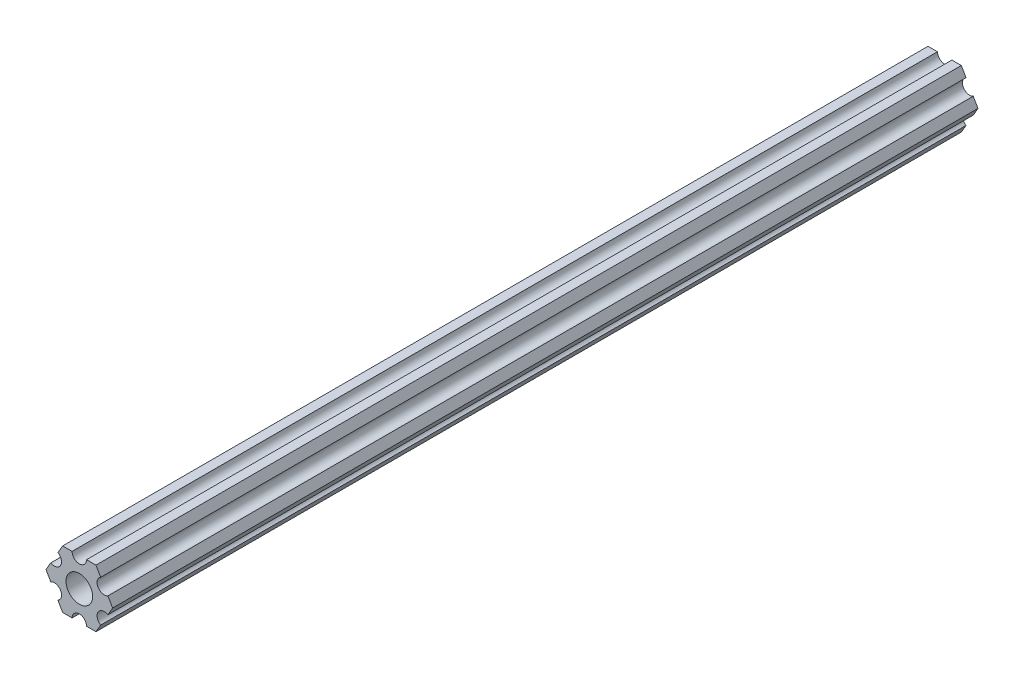
ISO-10303-21;
HEADER;
FILE_DESCRIPTION(('STEP AP214'),'2;1');
FILE_NAME('part.step','',(''),(''),'','','');
FILE_SCHEMA(('AUTOMOTIVE_DESIGN { 1 0 10303 214 1 1 1 1 }'));
ENDSEC;
DATA;
#1=APPLICATION_CONTEXT('core data for automotive mechanical design processes');
#2=APPLICATION_PROTOCOL_DEFINITION('international standard','automotive_design',2000,#1);
#3=PRODUCT_CONTEXT('',#1,'mechanical');
#4=PRODUCT('Part','Part','',(#3));
#5=PRODUCT_RELATED_PRODUCT_CATEGORY('part','',(#4));
#6=PRODUCT_DEFINITION_FORMATION('','',#4);
#7=PRODUCT_DEFINITION_CONTEXT('part definition',#1,'design');
#8=PRODUCT_DEFINITION('design','',#6,#7);
#9=PRODUCT_DEFINITION_SHAPE('','',#8);
#10=(LENGTH_UNIT() NAMED_UNIT(*) SI_UNIT(.MILLI.,.METRE.));
#11=(NAMED_UNIT(*) PLANE_ANGLE_UNIT() SI_UNIT($,.RADIAN.));
#12=(NAMED_UNIT(*) SI_UNIT($,.STERADIAN.) SOLID_ANGLE_UNIT());
#13=UNCERTAINTY_MEASURE_WITH_UNIT(LENGTH_MEASURE(1.E-05),#10,'distance_accuracy_value','');
#14=(GEOMETRIC_REPRESENTATION_CONTEXT(3) GLOBAL_UNCERTAINTY_ASSIGNED_CONTEXT((#13)) GLOBAL_UNIT_ASSIGNED_CONTEXT((#10,
#11,#12)) REPRESENTATION_CONTEXT('',''));
#15=CARTESIAN_POINT('',(0.,0.,0.));
#16=DIRECTION('',(0.,0.,1.));
#17=DIRECTION('',(1.,0.,0.));
#18=AXIS2_PLACEMENT_3D('',#15,#16,#17);
#19=CARTESIAN_POINT('',(5.49926169873049,-3.17500022210629,114.3));
#20=DIRECTION('',(0.,0.,1.));
#21=DIRECTION('',(1.,0.,0.));
#22=AXIS2_PLACEMENT_3D('',#19,#20,#21);
#23=CYLINDRICAL_SURFACE('',#22,1.5875);
#24=CARTESIAN_POINT('',(5.49926169873049,-3.17500022210629,304.8));
#25=DIRECTION('',(0.,0.,-1.));
#26=DIRECTION('',(-1.,0.,0.));
#27=AXIS2_PLACEMENT_3D('',#24,#25,#26);
#28=CIRCLE('',#27,1.5875);
#29=CARTESIAN_POINT('',(4.7055116987305,-4.5498155506141,304.8));
#30=VERTEX_POINT('',#29);
#31=CARTESIAN_POINT('',(6.29301169873047,-1.80018489359848,304.8));
#32=VERTEX_POINT('',#31);
#33=EDGE_CURVE('E189',#30,#32,#28,.T.);
#34=ORIENTED_EDGE('',*,*,#33,.F.);
#35=DIRECTION('',(0.,0.,1.));
#36=VECTOR('',#35,1.);
#37=CARTESIAN_POINT('',(4.7055116987305,-4.5498155506141,114.3));
#38=LINE('',#37,#36);
#39=CARTESIAN_POINT('',(4.7055116987305,-4.5498155506141,114.3));
#40=VERTEX_POINT('',#39);
#41=EDGE_CURVE('E11',#40,#30,#38,.T.);
#42=ORIENTED_EDGE('',*,*,#41,.F.);
#43=CARTESIAN_POINT('',(5.49926169873049,-3.17500022210629,114.3));
#44=DIRECTION('',(0.,0.,-1.));
#45=DIRECTION('',(-1.,0.,0.));
#46=AXIS2_PLACEMENT_3D('',#43,#44,#45);
#47=CIRCLE('',#46,1.5875);
#48=CARTESIAN_POINT('',(6.29301169873047,-1.80018489359848,114.3));
#49=VERTEX_POINT('',#48);
#50=EDGE_CURVE('E240',#40,#49,#47,.T.);
#51=ORIENTED_EDGE('',*,*,#50,.T.);
#52=DIRECTION('',(0.,0.,1.));
#53=VECTOR('',#52,1.);
#54=CARTESIAN_POINT('',(6.29301169873047,-1.80018489359848,114.3));
#55=LINE('',#54,#53);
#56=EDGE_CURVE('E35',#49,#32,#55,.T.);
#57=ORIENTED_EDGE('',*,*,#56,.T.);
#58=EDGE_LOOP('',(#34,#42,#51,#57));
#59=FACE_BOUND('',#58,.T.);
#60=ADVANCED_FACE('F32',(#59),#23,.F.);
#61=CARTESIAN_POINT('',(3.6661745940535,-6.35000022210627,114.3));
#62=DIRECTION('',(0.866025403784446,-0.499999999999988,0.));
#63=DIRECTION('',(0.499999999999988,0.866025403784446,0.));
#64=AXIS2_PLACEMENT_3D('',#61,#62,#63);
#65=PLANE('',#64);
#66=DIRECTION('',(0.499999999999988,0.866025403784446,0.));
#67=VECTOR('',#66,1.);
#68=CARTESIAN_POINT('',(3.6661745940535,-6.35000022210627,304.8));
#69=LINE('',#68,#67);
#70=CARTESIAN_POINT('',(3.6661745940535,-6.35000022210627,304.8));
#71=VERTEX_POINT('',#70);
#72=EDGE_CURVE('E238',#71,#30,#69,.T.);
#73=ORIENTED_EDGE('',*,*,#72,.F.);
#74=DIRECTION('',(0.,0.,1.));
#75=VECTOR('',#74,1.);
#76=CARTESIAN_POINT('',(3.6661745940535,-6.35000022210627,114.3));
#77=LINE('',#76,#75);
#78=CARTESIAN_POINT('',(3.6661745940535,-6.35000022210627,114.3));
#79=VERTEX_POINT('',#78);
#80=EDGE_CURVE('E41',#79,#71,#77,.T.);
#81=ORIENTED_EDGE('',*,*,#80,.F.);
#82=DIRECTION('',(0.499999999999988,0.866025403784446,0.));
#83=VECTOR('',#82,1.);
#84=CARTESIAN_POINT('',(3.6661745940535,-6.35000022210627,114.3));
#85=LINE('',#84,#83);
#86=EDGE_CURVE('E179',#79,#40,#85,.T.);
#87=ORIENTED_EDGE('',*,*,#86,.T.);
#88=ORIENTED_EDGE('',*,*,#41,.T.);
#89=EDGE_LOOP('',(#73,#81,#87,#88));
#90=FACE_BOUND('',#89,.T.);
#91=ADVANCED_FACE('F272',(#90),#65,.T.);
#92=CARTESIAN_POINT('',(1.58750038469929,-6.35000022210627,114.3));
#93=DIRECTION('',(0.,-1.,0.));
#94=DIRECTION('',(0.,0.,-1.));
#95=AXIS2_PLACEMENT_3D('',#92,#93,#94);
#96=PLANE('',#95);
#97=DIRECTION('',(1.,0.,0.));
#98=VECTOR('',#97,1.);
#99=CARTESIAN_POINT('',(1.58750038469929,-6.35000022210627,304.8));
#100=LINE('',#99,#98);
#101=CARTESIAN_POINT('',(1.58750038469929,-6.35000022210627,304.8));
#102=VERTEX_POINT('',#101);
#103=EDGE_CURVE('E166',#102,#71,#100,.T.);
#104=ORIENTED_EDGE('',*,*,#103,.F.);
#105=DIRECTION('',(0.,0.,1.));
#106=VECTOR('',#105,1.);
#107=CARTESIAN_POINT('',(1.58750038469929,-6.35000022210627,114.3));
#108=LINE('',#107,#106);
#109=CARTESIAN_POINT('',(1.58750038469929,-6.35000022210627,114.3));
#110=VERTEX_POINT('',#109);
#111=EDGE_CURVE('E161',#110,#102,#108,.T.);
#112=ORIENTED_EDGE('',*,*,#111,.F.);
#113=DIRECTION('',(1.,0.,0.));
#114=VECTOR('',#113,1.);
#115=CARTESIAN_POINT('',(1.58750038469929,-6.35000022210627,114.3));
#116=LINE('',#115,#114);
#117=EDGE_CURVE('E164',#110,#79,#116,.T.);
#118=ORIENTED_EDGE('',*,*,#117,.T.);
#119=ORIENTED_EDGE('',*,*,#80,.T.);
#120=EDGE_LOOP('',(#104,#112,#118,#119));
#121=FACE_BOUND('',#120,.T.);
#122=ADVANCED_FACE('F163',(#121),#96,.T.);
#123=CARTESIAN_POINT('',(3.84699290671026E-07,-6.35000022210627,114.3));
#124=DIRECTION('',(0.,0.,1.));
#125=DIRECTION('',(1.,0.,0.));
#126=AXIS2_PLACEMENT_3D('',#123,#124,#125);
#127=CYLINDRICAL_SURFACE('',#126,1.5875);
#128=CARTESIAN_POINT('',(3.84699290671026E-07,-6.35000022210627,304.8));
#129=DIRECTION('',(0.,0.,-1.));
#130=DIRECTION('',(-1.,0.,0.));
#131=AXIS2_PLACEMENT_3D('',#128,#129,#130);
#132=CIRCLE('',#131,1.5875);
#133=CARTESIAN_POINT('',(-1.58749961530071,-6.35000022210627,304.8));
#134=VERTEX_POINT('',#133);
#135=EDGE_CURVE('E235',#134,#102,#132,.T.);
#136=ORIENTED_EDGE('',*,*,#135,.F.);
#137=DIRECTION('',(0.,0.,1.));
#138=VECTOR('',#137,1.);
#139=CARTESIAN_POINT('',(-1.58749961530071,-6.35000022210627,114.3));
#140=LINE('',#139,#138);
#141=CARTESIAN_POINT('',(-1.58749961530071,-6.35000022210627,114.3));
#142=VERTEX_POINT('',#141);
#143=EDGE_CURVE('E171',#142,#134,#140,.T.);
#144=ORIENTED_EDGE('',*,*,#143,.F.);
#145=CARTESIAN_POINT('',(3.84699290671026E-07,-6.35000022210627,114.3));
#146=DIRECTION('',(0.,0.,-1.));
#147=DIRECTION('',(-1.,0.,0.));
#148=AXIS2_PLACEMENT_3D('',#145,#146,#147);
#149=CIRCLE('',#148,1.5875);
#150=EDGE_CURVE('E177',#142,#110,#149,.T.);
#151=ORIENTED_EDGE('',*,*,#150,.T.);
#152=ORIENTED_EDGE('',*,*,#111,.T.);
#153=EDGE_LOOP('',(#136,#144,#151,#152));
#154=FACE_BOUND('',#153,.T.);
#155=ADVANCED_FACE('F181',(#154),#127,.F.);
#156=CARTESIAN_POINT('',(-3.66617382465478,-6.35000022210627,114.3));
#157=DIRECTION('',(0.,-1.,0.));
#158=DIRECTION('',(1.,0.,0.));
#159=AXIS2_PLACEMENT_3D('',#156,#157,#158);
#160=PLANE('',#159);
#161=DIRECTION('',(1.,0.,0.));
#162=VECTOR('',#161,1.);
#163=CARTESIAN_POINT('',(-3.66617382465478,-6.35000022210627,304.8));
#164=LINE('',#163,#162);
#165=CARTESIAN_POINT('',(-3.66617382465478,-6.35000022210627,304.8));
#166=VERTEX_POINT('',#165);
#167=EDGE_CURVE('E232',#166,#134,#164,.T.);
#168=ORIENTED_EDGE('',*,*,#167,.F.);
#169=DIRECTION('',(0.,0.,1.));
#170=VECTOR('',#169,1.);
#171=CARTESIAN_POINT('',(-3.66617382465478,-6.35000022210627,114.3));
#172=LINE('',#171,#170);
#173=CARTESIAN_POINT('',(-3.66617382465478,-6.35000022210627,114.3));
#174=VERTEX_POINT('',#173);
#175=EDGE_CURVE('E244',#174,#166,#172,.T.);
#176=ORIENTED_EDGE('',*,*,#175,.F.);
#177=DIRECTION('',(1.,0.,0.));
#178=VECTOR('',#177,1.);
#179=CARTESIAN_POINT('',(-3.66617382465478,-6.35000022210627,114.3));
#180=LINE('',#179,#178);
#181=EDGE_CURVE('E182',#174,#142,#180,.T.);
#182=ORIENTED_EDGE('',*,*,#181,.T.);
#183=ORIENTED_EDGE('',*,*,#143,.T.);
#184=EDGE_LOOP('',(#168,#176,#182,#183));
#185=FACE_BOUND('',#184,.T.);
#186=ADVANCED_FACE('F285',(#185),#160,.T.);
#187=CARTESIAN_POINT('',(-4.70551103839171,-4.54981561357971,114.3));
#188=DIRECTION('',(-0.866025373493149,-0.500000052466048,0.));
#189=DIRECTION('',(0.500000052466048,-0.866025373493149,0.));
#190=AXIS2_PLACEMENT_3D('',#187,#188,#189);
#191=PLANE('',#190);
#192=DIRECTION('',(0.500000052466048,-0.866025373493149,0.));
#193=VECTOR('',#192,1.);
#194=CARTESIAN_POINT('',(-4.70551103839171,-4.54981561357971,304.8));
#195=LINE('',#194,#193);
#196=CARTESIAN_POINT('',(-4.70551103839171,-4.54981561357971,304.8));
#197=VERTEX_POINT('',#196);
#198=EDGE_CURVE('E229',#197,#166,#195,.T.);
#199=ORIENTED_EDGE('',*,*,#198,.F.);
#200=DIRECTION('',(0.,0.,1.));
#201=VECTOR('',#200,1.);
#202=CARTESIAN_POINT('',(-4.70551103839171,-4.54981561357971,114.3));
#203=LINE('',#202,#201);
#204=CARTESIAN_POINT('',(-4.70551103839171,-4.54981561357971,114.3));
#205=VERTEX_POINT('',#204);
#206=EDGE_CURVE('E246',#205,#197,#203,.T.);
#207=ORIENTED_EDGE('',*,*,#206,.F.);
#208=DIRECTION('',(0.500000052466048,-0.866025373493149,0.));
#209=VECTOR('',#208,1.);
#210=CARTESIAN_POINT('',(-4.70551103839171,-4.54981561357971,114.3));
#211=LINE('',#210,#209);
#212=EDGE_CURVE('E184',#205,#174,#211,.T.);
#213=ORIENTED_EDGE('',*,*,#212,.T.);
#214=ORIENTED_EDGE('',*,*,#175,.T.);
#215=EDGE_LOOP('',(#199,#207,#213,#214));
#216=FACE_BOUND('',#215,.T.);
#217=ADVANCED_FACE('F288',(#216),#191,.T.);
#218=CARTESIAN_POINT('',(-5.49926112168156,-3.17500033315934,114.3));
#219=DIRECTION('',(0.,0.,1.));
#220=DIRECTION('',(1.,0.,0.));
#221=AXIS2_PLACEMENT_3D('',#218,#219,#220);
#222=CYLINDRICAL_SURFACE('',#221,1.5875);
#223=CARTESIAN_POINT('',(-5.49926112168156,-3.17500033315934,304.8));
#224=DIRECTION('',(0.,0.,-1.));
#225=DIRECTION('',(-1.,0.,0.));
#226=AXIS2_PLACEMENT_3D('',#223,#224,#225);
#227=CIRCLE('',#226,1.5875);
#228=CARTESIAN_POINT('',(-6.29301120497141,-1.80018505273897,304.8));
#229=VERTEX_POINT('',#228);
#230=EDGE_CURVE('E226',#229,#197,#227,.T.);
#231=ORIENTED_EDGE('',*,*,#230,.F.);
#232=DIRECTION('',(0.,0.,1.));
#233=VECTOR('',#232,1.);
#234=CARTESIAN_POINT('',(-6.29301120497141,-1.80018505273897,114.3));
#235=LINE('',#234,#233);
#236=CARTESIAN_POINT('',(-6.29301120497141,-1.80018505273897,114.3));
#237=VERTEX_POINT('',#236);
#238=EDGE_CURVE('E248',#237,#229,#235,.T.);
#239=ORIENTED_EDGE('',*,*,#238,.F.);
#240=CARTESIAN_POINT('',(-5.49926112168156,-3.17500033315934,114.3));
#241=DIRECTION('',(0.,0.,-1.));
#242=DIRECTION('',(-1.,0.,0.));
#243=AXIS2_PLACEMENT_3D('',#240,#241,#242);
#244=CIRCLE('',#243,1.5875);
#245=EDGE_CURVE('E393',#237,#205,#244,.T.);
#246=ORIENTED_EDGE('',*,*,#245,.T.);
#247=ORIENTED_EDGE('',*,*,#206,.T.);
#248=EDGE_LOOP('',(#231,#239,#246,#247));
#249=FACE_BOUND('',#248,.T.);
#250=ADVANCED_FACE('F292',(#249),#222,.F.);
#251=CARTESIAN_POINT('',(-7.33234841870827,-4.44212523790841E-07,114.3));
#252=DIRECTION('',(-0.866025373493149,-0.500000052466048,0.));
#253=DIRECTION('',(0.500000052466048,-0.866025373493149,0.));
#254=AXIS2_PLACEMENT_3D('',#251,#252,#253);
#255=PLANE('',#254);
#256=DIRECTION('',(0.500000052466048,-0.86602537349315,0.));
#257=VECTOR('',#256,1.);
#258=CARTESIAN_POINT('',(-7.33234841870827,-4.44212523790841E-07,304.8));
#259=LINE('',#258,#257);
#260=CARTESIAN_POINT('',(-7.33234841870827,-4.44212523790841E-07,304.8));
#261=VERTEX_POINT('',#260);
#262=EDGE_CURVE('E223',#261,#229,#259,.T.);
#263=ORIENTED_EDGE('',*,*,#262,.F.);
#264=DIRECTION('',(0.,0.,1.));
#265=VECTOR('',#264,1.);
#266=CARTESIAN_POINT('',(-7.33234841870827,-4.44212523790841E-07,114.3));
#267=LINE('',#266,#265);
#268=CARTESIAN_POINT('',(-7.33234841870827,-4.44212523790841E-07,114.3));
#269=VERTEX_POINT('',#268);
#270=EDGE_CURVE('E250',#269,#261,#267,.T.);
#271=ORIENTED_EDGE('',*,*,#270,.F.);
#272=DIRECTION('',(0.500000052466048,-0.86602537349315,0.));
#273=VECTOR('',#272,1.);
#274=CARTESIAN_POINT('',(-7.33234841870827,-4.44212523790841E-07,114.3));
#275=LINE('',#274,#273);
#276=EDGE_CURVE('E390',#269,#237,#275,.T.);
#277=ORIENTED_EDGE('',*,*,#276,.T.);
#278=ORIENTED_EDGE('',*,*,#238,.T.);
#279=EDGE_LOOP('',(#263,#271,#277,#278));
#280=FACE_BOUND('',#279,.T.);
#281=ADVANCED_FACE('F296',(#280),#255,.T.);
#282=CARTESIAN_POINT('',(-6.29301142309098,1.80018429024547,114.3));
#283=DIRECTION('',(-0.866025434075722,0.499999947533955,0.));
#284=DIRECTION('',(-0.499999947533955,-0.866025434075722,0.));
#285=AXIS2_PLACEMENT_3D('',#282,#283,#284);
#286=PLANE('',#285);
#287=DIRECTION('',(-0.499999947533955,-0.866025434075722,0.));
#288=VECTOR('',#287,1.);
#289=CARTESIAN_POINT('',(-6.29301142309098,1.80018429024547,304.8));
#290=LINE('',#289,#288);
#291=CARTESIAN_POINT('',(-6.29301142309098,1.80018429024546,304.8));
#292=VERTEX_POINT('',#291);
#293=EDGE_CURVE('E220',#292,#261,#290,.T.);
#294=ORIENTED_EDGE('',*,*,#293,.F.);
#295=DIRECTION('',(0.,0.,1.));
#296=VECTOR('',#295,1.);
#297=CARTESIAN_POINT('',(-6.29301142309098,1.80018429024546,114.3));
#298=LINE('',#297,#296);
#299=CARTESIAN_POINT('',(-6.29301142309098,1.80018429024546,114.3));
#300=VERTEX_POINT('',#299);
#301=EDGE_CURVE('E252',#300,#292,#298,.T.);
#302=ORIENTED_EDGE('',*,*,#301,.F.);
#303=DIRECTION('',(-0.499999947533955,-0.866025434075722,0.));
#304=VECTOR('',#303,1.);
#305=CARTESIAN_POINT('',(-6.29301142309098,1.80018429024547,114.3));
#306=LINE('',#305,#304);
#307=EDGE_CURVE('E387',#300,#269,#306,.T.);
#308=ORIENTED_EDGE('',*,*,#307,.T.);
#309=ORIENTED_EDGE('',*,*,#270,.T.);
#310=EDGE_LOOP('',(#294,#302,#308,#309));
#311=FACE_BOUND('',#310,.T.);
#312=ADVANCED_FACE('F300',(#311),#286,.T.);
#313=CARTESIAN_POINT('',(-5.49926150638083,3.17499966684067,114.3));
#314=DIRECTION('',(0.,0.,1.));
#315=DIRECTION('',(1.,0.,0.));
#316=AXIS2_PLACEMENT_3D('',#313,#314,#315);
#317=CYLINDRICAL_SURFACE('',#316,1.5875);
#318=CARTESIAN_POINT('',(-5.49926150638083,3.17499966684067,304.8));
#319=DIRECTION('',(0.,0.,-1.));
#320=DIRECTION('',(-1.,0.,0.));
#321=AXIS2_PLACEMENT_3D('',#318,#319,#320);
#322=CIRCLE('',#321,1.5875);
#323=CARTESIAN_POINT('',(-4.70551158967067,4.54981504343588,304.8));
#324=VERTEX_POINT('',#323);
#325=EDGE_CURVE('E217',#324,#292,#322,.T.);
#326=ORIENTED_EDGE('',*,*,#325,.F.);
#327=DIRECTION('',(0.,0.,1.));
#328=VECTOR('',#327,1.);
#329=CARTESIAN_POINT('',(-4.70551158967067,4.54981504343588,114.3));
#330=LINE('',#329,#328);
#331=CARTESIAN_POINT('',(-4.70551158967067,4.54981504343588,114.3));
#332=VERTEX_POINT('',#331);
#333=EDGE_CURVE('E254',#332,#324,#330,.T.);
#334=ORIENTED_EDGE('',*,*,#333,.F.);
#335=CARTESIAN_POINT('',(-5.49926150638083,3.17499966684067,114.3));
#336=DIRECTION('',(0.,0.,-1.));
#337=DIRECTION('',(-1.,0.,0.));
#338=AXIS2_PLACEMENT_3D('',#335,#336,#337);
#339=CIRCLE('',#338,1.5875);
#340=EDGE_CURVE('E384',#332,#300,#339,.T.);
#341=ORIENTED_EDGE('',*,*,#340,.T.);
#342=ORIENTED_EDGE('',*,*,#301,.T.);
#343=EDGE_LOOP('',(#326,#334,#341,#342));
#344=FACE_BOUND('',#343,.T.);
#345=ADVANCED_FACE('F304',(#344),#317,.F.);
#346=CARTESIAN_POINT('',(-3.66617459405348,6.3499997778937,114.3));
#347=DIRECTION('',(-0.866025434075722,0.499999947533955,0.));
#348=DIRECTION('',(-0.499999947533955,-0.866025434075722,0.));
#349=AXIS2_PLACEMENT_3D('',#346,#347,#348);
#350=PLANE('',#349);
#351=DIRECTION('',(-0.499999947533955,-0.866025434075722,0.));
#352=VECTOR('',#351,1.);
#353=CARTESIAN_POINT('',(-3.66617459405348,6.3499997778937,304.8));
#354=LINE('',#353,#352);
#355=CARTESIAN_POINT('',(-3.66617459405348,6.3499997778937,304.8));
#356=VERTEX_POINT('',#355);
#357=EDGE_CURVE('E214',#356,#324,#354,.T.);
#358=ORIENTED_EDGE('',*,*,#357,.F.);
#359=DIRECTION('',(0.,0.,1.));
#360=VECTOR('',#359,1.);
#361=CARTESIAN_POINT('',(-3.66617459405348,6.3499997778937,114.3));
#362=LINE('',#361,#360);
#363=CARTESIAN_POINT('',(-3.66617459405348,6.3499997778937,114.3));
#364=VERTEX_POINT('',#363);
#365=EDGE_CURVE('E256',#364,#356,#362,.T.);
#366=ORIENTED_EDGE('',*,*,#365,.F.);
#367=DIRECTION('',(-0.499999947533955,-0.866025434075722,0.));
#368=VECTOR('',#367,1.);
#369=CARTESIAN_POINT('',(-3.66617459405348,6.3499997778937,114.3));
#370=LINE('',#369,#368);
#371=EDGE_CURVE('E381',#364,#332,#370,.T.);
#372=ORIENTED_EDGE('',*,*,#371,.T.);
#373=ORIENTED_EDGE('',*,*,#333,.T.);
#374=EDGE_LOOP('',(#358,#366,#372,#373));
#375=FACE_BOUND('',#374,.T.);
#376=ADVANCED_FACE('F308',(#375),#350,.T.);
#377=CARTESIAN_POINT('',(-1.58750038469926,6.3499997778937,114.3));
#378=DIRECTION('',(0.,1.,0.));
#379=DIRECTION('',(0.,0.,1.));
#380=AXIS2_PLACEMENT_3D('',#377,#378,#379);
#381=PLANE('',#380);
#382=DIRECTION('',(-1.,0.,0.));
#383=VECTOR('',#382,1.);
#384=CARTESIAN_POINT('',(-1.58750038469926,6.3499997778937,304.8));
#385=LINE('',#384,#383);
#386=CARTESIAN_POINT('',(-1.58750038469926,6.3499997778937,304.8));
#387=VERTEX_POINT('',#386);
#388=EDGE_CURVE('E211',#387,#356,#385,.T.);
#389=ORIENTED_EDGE('',*,*,#388,.F.);
#390=DIRECTION('',(0.,0.,1.));
#391=VECTOR('',#390,1.);
#392=CARTESIAN_POINT('',(-1.58750038469926,6.3499997778937,114.3));
#393=LINE('',#392,#391);
#394=CARTESIAN_POINT('',(-1.58750038469926,6.3499997778937,114.3));
#395=VERTEX_POINT('',#394);
#396=EDGE_CURVE('E258',#395,#387,#393,.T.);
#397=ORIENTED_EDGE('',*,*,#396,.F.);
#398=DIRECTION('',(-1.,0.,0.));
#399=VECTOR('',#398,1.);
#400=CARTESIAN_POINT('',(-1.58750038469926,6.3499997778937,114.3));
#401=LINE('',#400,#399);
#402=EDGE_CURVE('E378',#395,#364,#401,.T.);
#403=ORIENTED_EDGE('',*,*,#402,.T.);
#404=ORIENTED_EDGE('',*,*,#365,.T.);
#405=EDGE_LOOP('',(#389,#397,#403,#404));
#406=FACE_BOUND('',#405,.T.);
#407=ADVANCED_FACE('F312',(#406),#381,.T.);
#408=CARTESIAN_POINT('',(-3.84699252021695E-07,6.3499997778937,114.3));
#409=DIRECTION('',(0.,0.,1.));
#410=DIRECTION('',(1.,0.,0.));
#411=AXIS2_PLACEMENT_3D('',#408,#409,#410);
#412=CYLINDRICAL_SURFACE('',#411,1.5875);
#413=CARTESIAN_POINT('',(-3.84699252021695E-07,6.3499997778937,304.8));
#414=DIRECTION('',(0.,0.,-1.));
#415=DIRECTION('',(-1.,0.,0.));
#416=AXIS2_PLACEMENT_3D('',#413,#414,#415);
#417=CIRCLE('',#416,1.5875);
#418=CARTESIAN_POINT('',(1.58749961530075,6.3499997778937,304.8));
#419=VERTEX_POINT('',#418);
#420=EDGE_CURVE('E208',#419,#387,#417,.T.);
#421=ORIENTED_EDGE('',*,*,#420,.F.);
#422=DIRECTION('',(0.,0.,1.));
#423=VECTOR('',#422,1.);
#424=CARTESIAN_POINT('',(1.58749961530075,6.3499997778937,114.3));
#425=LINE('',#424,#423);
#426=CARTESIAN_POINT('',(1.58749961530075,6.3499997778937,114.3));
#427=VERTEX_POINT('',#426);
#428=EDGE_CURVE('E260',#427,#419,#425,.T.);
#429=ORIENTED_EDGE('',*,*,#428,.F.);
#430=CARTESIAN_POINT('',(-3.84699252021695E-07,6.3499997778937,114.3));
#431=DIRECTION('',(0.,0.,-1.));
#432=DIRECTION('',(-1.,0.,0.));
#433=AXIS2_PLACEMENT_3D('',#430,#431,#432);
#434=CIRCLE('',#433,1.5875);
#435=EDGE_CURVE('E375',#427,#395,#434,.T.);
#436=ORIENTED_EDGE('',*,*,#435,.T.);
#437=ORIENTED_EDGE('',*,*,#396,.T.);
#438=EDGE_LOOP('',(#421,#429,#436,#437));
#439=FACE_BOUND('',#438,.T.);
#440=ADVANCED_FACE('F316',(#439),#412,.F.);
#441=CARTESIAN_POINT('',(3.66617382465482,6.3499997778937,114.3));
#442=DIRECTION('',(0.,1.,0.));
#443=DIRECTION('',(0.,0.,1.));
#444=AXIS2_PLACEMENT_3D('',#441,#442,#443);
#445=PLANE('',#444);
#446=DIRECTION('',(-1.,0.,0.));
#447=VECTOR('',#446,1.);
#448=CARTESIAN_POINT('',(3.66617382465482,6.3499997778937,304.8));
#449=LINE('',#448,#447);
#450=CARTESIAN_POINT('',(3.66617382465482,6.3499997778937,304.8));
#451=VERTEX_POINT('',#450);
#452=EDGE_CURVE('E205',#451,#419,#449,.T.);
#453=ORIENTED_EDGE('',*,*,#452,.F.);
#454=DIRECTION('',(0.,0.,1.));
#455=VECTOR('',#454,1.);
#456=CARTESIAN_POINT('',(3.66617382465482,6.3499997778937,114.3));
#457=LINE('',#456,#455);
#458=CARTESIAN_POINT('',(3.66617382465482,6.3499997778937,114.3));
#459=VERTEX_POINT('',#458);
#460=EDGE_CURVE('E262',#459,#451,#457,.T.);
#461=ORIENTED_EDGE('',*,*,#460,.F.);
#462=DIRECTION('',(-1.,0.,0.));
#463=VECTOR('',#462,1.);
#464=CARTESIAN_POINT('',(3.66617382465482,6.3499997778937,114.3));
#465=LINE('',#464,#463);
#466=EDGE_CURVE('E372',#459,#427,#465,.T.);
#467=ORIENTED_EDGE('',*,*,#466,.T.);
#468=ORIENTED_EDGE('',*,*,#428,.T.);
#469=EDGE_LOOP('',(#453,#461,#467,#468));
#470=FACE_BOUND('',#469,.T.);
#471=ADVANCED_FACE('F320',(#470),#445,.T.);
#472=CARTESIAN_POINT('',(4.70551118909645,4.54981503427037,114.3));
#473=DIRECTION('',(0.866025358347508,0.500000078699064,0.));
#474=DIRECTION('',(-0.500000078699064,0.866025358347508,0.));
#475=AXIS2_PLACEMENT_3D('',#472,#473,#474);
#476=PLANE('',#475);
#477=DIRECTION('',(-0.500000078699064,0.866025358347508,0.));
#478=VECTOR('',#477,1.);
#479=CARTESIAN_POINT('',(4.70551118909645,4.54981503427037,304.8));
#480=LINE('',#479,#478);
#481=CARTESIAN_POINT('',(4.70551118909645,4.54981503427037,304.8));
#482=VERTEX_POINT('',#481);
#483=EDGE_CURVE('E202',#482,#451,#480,.T.);
#484=ORIENTED_EDGE('',*,*,#483,.F.);
#485=DIRECTION('',(0.,0.,1.));
#486=VECTOR('',#485,1.);
#487=CARTESIAN_POINT('',(4.70551118909645,4.54981503427037,114.3));
#488=LINE('',#487,#486);
#489=CARTESIAN_POINT('',(4.70551118909645,4.54981503427037,114.3));
#490=VERTEX_POINT('',#489);
#491=EDGE_CURVE('E264',#490,#482,#488,.T.);
#492=ORIENTED_EDGE('',*,*,#491,.F.);
#493=DIRECTION('',(-0.500000078699064,0.866025358347508,0.));
#494=VECTOR('',#493,1.);
#495=CARTESIAN_POINT('',(4.70551118909645,4.54981503427037,114.3));
#496=LINE('',#495,#494);
#497=EDGE_CURVE('E369',#490,#459,#496,.T.);
#498=ORIENTED_EDGE('',*,*,#497,.T.);
#499=ORIENTED_EDGE('',*,*,#460,.T.);
#500=EDGE_LOOP('',(#484,#492,#498,#499));
#501=FACE_BOUND('',#500,.T.);
#502=ADVANCED_FACE('F324',(#501),#476,.T.);
#503=CARTESIAN_POINT('',(5.49926131403121,3.1749997778937,114.3));
#504=DIRECTION('',(0.,0.,1.));
#505=DIRECTION('',(1.,0.,0.));
#506=AXIS2_PLACEMENT_3D('',#503,#504,#505);
#507=CYLINDRICAL_SURFACE('',#506,1.5875);
#508=CARTESIAN_POINT('',(5.49926131403121,3.1749997778937,304.8));
#509=DIRECTION('',(0.,0.,-1.));
#510=DIRECTION('',(-1.,0.,0.));
#511=AXIS2_PLACEMENT_3D('',#508,#509,#510);
#512=CIRCLE('',#511,1.5875);
#513=CARTESIAN_POINT('',(6.29301143896598,1.80018452151703,304.8));
#514=VERTEX_POINT('',#513);
#515=EDGE_CURVE('E199',#514,#482,#512,.T.);
#516=ORIENTED_EDGE('',*,*,#515,.F.);
#517=DIRECTION('',(0.,0.,1.));
#518=VECTOR('',#517,1.);
#519=CARTESIAN_POINT('',(6.29301143896598,1.80018452151703,114.3));
#520=LINE('',#519,#518);
#521=CARTESIAN_POINT('',(6.29301143896598,1.80018452151703,114.3));
#522=VERTEX_POINT('',#521);
#523=EDGE_CURVE('E266',#522,#514,#520,.T.);
#524=ORIENTED_EDGE('',*,*,#523,.F.);
#525=CARTESIAN_POINT('',(5.49926131403121,3.1749997778937,114.3));
#526=DIRECTION('',(0.,0.,-1.));
#527=DIRECTION('',(-1.,0.,0.));
#528=AXIS2_PLACEMENT_3D('',#525,#526,#527);
#529=CIRCLE('',#528,1.5875);
#530=EDGE_CURVE('E366',#522,#490,#529,.T.);
#531=ORIENTED_EDGE('',*,*,#530,.T.);
#532=ORIENTED_EDGE('',*,*,#491,.T.);
#533=EDGE_LOOP('',(#516,#524,#531,#532));
#534=FACE_BOUND('',#533,.T.);
#535=ADVANCED_FACE('F328',(#534),#507,.F.);
#536=CARTESIAN_POINT('',(7.33234880340755,-2.22106190273918E-07,114.3));
#537=DIRECTION('',(0.866025358347509,0.500000078699063,0.));
#538=DIRECTION('',(-0.500000078699063,0.866025358347509,0.));
#539=AXIS2_PLACEMENT_3D('',#536,#537,#538);
#540=PLANE('',#539);
#541=DIRECTION('',(-0.500000078699063,0.866025358347509,0.));
#542=VECTOR('',#541,1.);
#543=CARTESIAN_POINT('',(7.33234880340755,-2.22106190273918E-07,304.8));
#544=LINE('',#543,#542);
#545=CARTESIAN_POINT('',(7.33234880340755,-2.22106190273918E-07,304.8));
#546=VERTEX_POINT('',#545);
#547=EDGE_CURVE('E196',#546,#514,#544,.T.);
#548=ORIENTED_EDGE('',*,*,#547,.F.);
#549=DIRECTION('',(0.,0.,1.));
#550=VECTOR('',#549,1.);
#551=CARTESIAN_POINT('',(7.33234880340755,-2.22106190273918E-07,114.3));
#552=LINE('',#551,#550);
#553=CARTESIAN_POINT('',(7.33234880340755,-2.22106190273918E-07,114.3));
#554=VERTEX_POINT('',#553);
#555=EDGE_CURVE('E267',#554,#546,#552,.T.);
#556=ORIENTED_EDGE('',*,*,#555,.F.);
#557=DIRECTION('',(-0.500000078699063,0.866025358347509,0.));
#558=VECTOR('',#557,1.);
#559=CARTESIAN_POINT('',(7.33234880340755,-2.22106190273918E-07,114.3));
#560=LINE('',#559,#558);
#561=EDGE_CURVE('E363',#554,#522,#560,.T.);
#562=ORIENTED_EDGE('',*,*,#561,.T.);
#563=ORIENTED_EDGE('',*,*,#523,.T.);
#564=EDGE_LOOP('',(#548,#556,#562,#563));
#565=FACE_BOUND('',#564,.T.);
#566=ADVANCED_FACE('F332',(#565),#540,.T.);
#567=CARTESIAN_POINT('',(6.29301169873047,-1.80018489359848,114.3));
#568=DIRECTION('',(0.866025403784446,-0.499999999999988,0.));
#569=DIRECTION('',(0.499999999999988,0.866025403784446,0.));
#570=AXIS2_PLACEMENT_3D('',#567,#568,#569);
#571=PLANE('',#570);
#572=DIRECTION('',(0.499999999999988,0.866025403784446,0.));
#573=VECTOR('',#572,1.);
#574=CARTESIAN_POINT('',(6.29301169873047,-1.80018489359848,304.8));
#575=LINE('',#574,#573);
#576=EDGE_CURVE('E192',#32,#546,#575,.T.);
#577=ORIENTED_EDGE('',*,*,#576,.F.);
#578=ORIENTED_EDGE('',*,*,#56,.F.);
#579=DIRECTION('',(0.499999999999988,0.866025403784446,0.));
#580=VECTOR('',#579,1.);
#581=CARTESIAN_POINT('',(6.29301169873047,-1.80018489359848,114.3));
#582=LINE('',#581,#580);
#583=EDGE_CURVE('E361',#49,#554,#582,.T.);
#584=ORIENTED_EDGE('',*,*,#583,.T.);
#585=ORIENTED_EDGE('',*,*,#555,.T.);
#586=EDGE_LOOP('',(#577,#578,#584,#585));
#587=FACE_BOUND('',#586,.T.);
#588=ADVANCED_FACE('F269',(#587),#571,.T.);
#589=CARTESIAN_POINT('',(5.49926169873049,-3.17500022210629,114.3));
#590=DIRECTION('',(0.,0.,-1.));
#591=DIRECTION('',(-1.,0.,0.));
#592=AXIS2_PLACEMENT_3D('',#589,#590,#591);
#593=PLANE('',#592);
#594=CARTESIAN_POINT('',(0.,0.,114.3));
#595=DIRECTION('',(0.,0.,1.));
#596=DIRECTION('',(-1.,0.,0.));
#597=AXIS2_PLACEMENT_3D('',#594,#595,#596);
#598=CIRCLE('',#597,2.9337);
#599=CARTESIAN_POINT('',(-2.9337,0.,114.3));
#600=VERTEX_POINT('',#599);
#601=EDGE_CURVE('E193',#600,#600,#598,.T.);
#602=ORIENTED_EDGE('',*,*,#601,.T.);
#603=EDGE_LOOP('',(#602));
#604=FACE_BOUND('',#603,.T.);
#605=ORIENTED_EDGE('',*,*,#50,.F.);
#606=ORIENTED_EDGE('',*,*,#86,.F.);
#607=ORIENTED_EDGE('',*,*,#117,.F.);
#608=ORIENTED_EDGE('',*,*,#150,.F.);
#609=ORIENTED_EDGE('',*,*,#181,.F.);
#610=ORIENTED_EDGE('',*,*,#212,.F.);
#611=ORIENTED_EDGE('',*,*,#245,.F.);
#612=ORIENTED_EDGE('',*,*,#276,.F.);
#613=ORIENTED_EDGE('',*,*,#307,.F.);
#614=ORIENTED_EDGE('',*,*,#340,.F.);
#615=ORIENTED_EDGE('',*,*,#371,.F.);
#616=ORIENTED_EDGE('',*,*,#402,.F.);
#617=ORIENTED_EDGE('',*,*,#435,.F.);
#618=ORIENTED_EDGE('',*,*,#466,.F.);
#619=ORIENTED_EDGE('',*,*,#497,.F.);
#620=ORIENTED_EDGE('',*,*,#530,.F.);
#621=ORIENTED_EDGE('',*,*,#561,.F.);
#622=ORIENTED_EDGE('',*,*,#583,.F.);
#623=EDGE_LOOP('',(#605,#606,#607,#608,#609,#610,#611,#612,#613,#614,#615,#616,#617,#618,#619,
#620,#621,#622));
#624=FACE_BOUND('',#623,.T.);
#625=ADVANCED_FACE('F175',(#604,#624),#593,.T.);
#626=CARTESIAN_POINT('',(5.49926169873049,-3.17500022210629,304.8));
#627=DIRECTION('',(0.,0.,-1.));
#628=DIRECTION('',(-1.,0.,0.));
#629=AXIS2_PLACEMENT_3D('',#626,#627,#628);
#630=PLANE('',#629);
#631=CARTESIAN_POINT('',(0.,0.,304.8));
#632=DIRECTION('',(0.,0.,1.));
#633=DIRECTION('',(-1.,0.,0.));
#634=AXIS2_PLACEMENT_3D('',#631,#632,#633);
#635=CIRCLE('',#634,2.9337);
#636=CARTESIAN_POINT('',(-2.9337,0.,304.8));
#637=VERTEX_POINT('',#636);
#638=EDGE_CURVE('E356',#637,#637,#635,.T.);
#639=ORIENTED_EDGE('',*,*,#638,.F.);
#640=EDGE_LOOP('',(#639));
#641=FACE_BOUND('',#640,.T.);
#642=ORIENTED_EDGE('',*,*,#33,.T.);
#643=ORIENTED_EDGE('',*,*,#576,.T.);
#644=ORIENTED_EDGE('',*,*,#547,.T.);
#645=ORIENTED_EDGE('',*,*,#515,.T.);
#646=ORIENTED_EDGE('',*,*,#483,.T.);
#647=ORIENTED_EDGE('',*,*,#452,.T.);
#648=ORIENTED_EDGE('',*,*,#420,.T.);
#649=ORIENTED_EDGE('',*,*,#388,.T.);
#650=ORIENTED_EDGE('',*,*,#357,.T.);
#651=ORIENTED_EDGE('',*,*,#325,.T.);
#652=ORIENTED_EDGE('',*,*,#293,.T.);
#653=ORIENTED_EDGE('',*,*,#262,.T.);
#654=ORIENTED_EDGE('',*,*,#230,.T.);
#655=ORIENTED_EDGE('',*,*,#198,.T.);
#656=ORIENTED_EDGE('',*,*,#167,.T.);
#657=ORIENTED_EDGE('',*,*,#135,.T.);
#658=ORIENTED_EDGE('',*,*,#103,.T.);
#659=ORIENTED_EDGE('',*,*,#72,.T.);
#660=EDGE_LOOP('',(#642,#643,#644,#645,#646,#647,#648,#649,#650,#651,#652,#653,#654,#655,#656,
#657,#658,#659));
#661=FACE_BOUND('',#660,.T.);
#662=ADVANCED_FACE('F271',(#641,#661),#630,.F.);
#663=CARTESIAN_POINT('',(0.,0.,114.3));
#664=DIRECTION('',(0.,0.,1.));
#665=DIRECTION('',(1.,0.,0.));
#666=AXIS2_PLACEMENT_3D('',#663,#664,#665);
#667=CYLINDRICAL_SURFACE('',#666,2.9337);
#668=ORIENTED_EDGE('',*,*,#601,.F.);
#669=EDGE_LOOP('',(#668));
#670=FACE_BOUND('',#669,.T.);
#671=ORIENTED_EDGE('',*,*,#638,.T.);
#672=EDGE_LOOP('',(#671));
#673=FACE_BOUND('',#672,.T.);
#674=ADVANCED_FACE('F344',(#670,#673),#667,.F.);
#675=CLOSED_SHELL('',(#60,#91,#122,#155,#186,#217,#250,#281,#312,#345,#376,#407,#440,#471,#502,
#535,#566,#588,#625,#662,#674));
#676=MANIFOLD_SOLID_BREP('B2',#675);
#677=ADVANCED_BREP_SHAPE_REPRESENTATION('',(#18,#676),#14);
#678=SHAPE_DEFINITION_REPRESENTATION(#9,#677);
ENDSEC;
END-ISO-10303-21;
